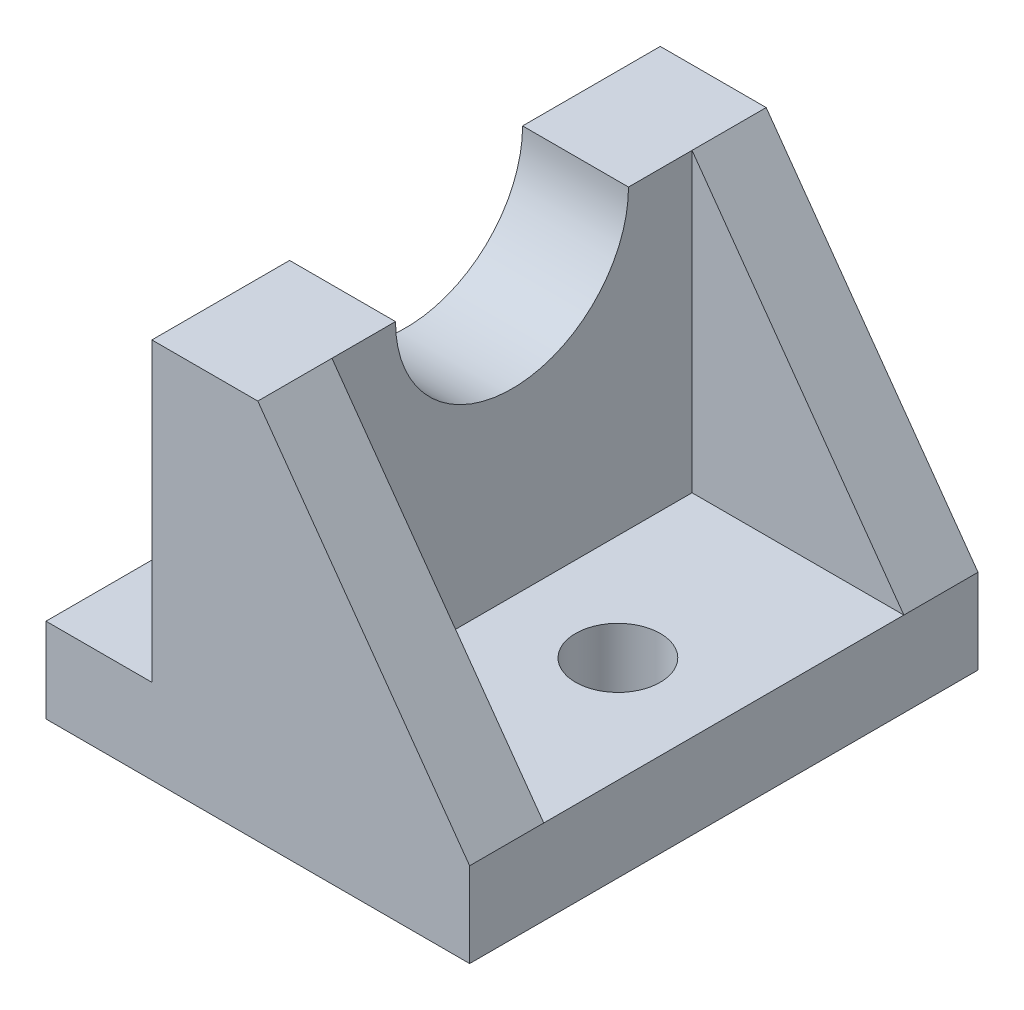
ISO-10303-21;
HEADER;
FILE_DESCRIPTION(('STEP AP214'),'2;1');
FILE_NAME('part.step','',(''),(''),'','','');
FILE_SCHEMA(('AUTOMOTIVE_DESIGN { 1 0 10303 214 1 1 1 1 }'));
ENDSEC;
DATA;
#1=APPLICATION_CONTEXT('core data for automotive mechanical design processes');
#2=APPLICATION_PROTOCOL_DEFINITION('international standard','automotive_design',2000,#1);
#3=PRODUCT_CONTEXT('',#1,'mechanical');
#4=PRODUCT('Part','Part','',(#3));
#5=PRODUCT_RELATED_PRODUCT_CATEGORY('part','',(#4));
#6=PRODUCT_DEFINITION_FORMATION('','',#4);
#7=PRODUCT_DEFINITION_CONTEXT('part definition',#1,'design');
#8=PRODUCT_DEFINITION('design','',#6,#7);
#9=PRODUCT_DEFINITION_SHAPE('','',#8);
#10=(LENGTH_UNIT() NAMED_UNIT(*) SI_UNIT(.MILLI.,.METRE.));
#11=(NAMED_UNIT(*) PLANE_ANGLE_UNIT() SI_UNIT($,.RADIAN.));
#12=(NAMED_UNIT(*) SI_UNIT($,.STERADIAN.) SOLID_ANGLE_UNIT());
#13=UNCERTAINTY_MEASURE_WITH_UNIT(LENGTH_MEASURE(1.E-05),#10,'distance_accuracy_value','');
#14=(GEOMETRIC_REPRESENTATION_CONTEXT(3) GLOBAL_UNCERTAINTY_ASSIGNED_CONTEXT((#13)) GLOBAL_UNIT_ASSIGNED_CONTEXT((#10,
#11,#12)) REPRESENTATION_CONTEXT('',''));
#15=CARTESIAN_POINT('',(0.,0.,0.));
#16=DIRECTION('',(0.,0.,1.));
#17=DIRECTION('',(1.,0.,0.));
#18=AXIS2_PLACEMENT_3D('',#15,#16,#17);
#19=CARTESIAN_POINT('',(0.,45.,60.));
#20=DIRECTION('',(0.,1.,0.));
#21=DIRECTION('',(0.,0.,1.));
#22=AXIS2_PLACEMENT_3D('',#19,#20,#21);
#23=PLANE('',#22);
#24=DIRECTION('',(-1.,0.,0.));
#25=VECTOR('',#24,1.);
#26=CARTESIAN_POINT('',(50.,45.,-27.5));
#27=LINE('',#26,#25);
#28=CARTESIAN_POINT('',(0.,45.,-27.5));
#29=VERTEX_POINT('',#28);
#30=CARTESIAN_POINT('',(-25.,45.,-27.5));
#31=VERTEX_POINT('',#30);
#32=EDGE_CURVE('E127',#29,#31,#27,.T.);
#33=ORIENTED_EDGE('',*,*,#32,.F.);
#34=DIRECTION('',(0.,0.,1.));
#35=VECTOR('',#34,1.);
#36=CARTESIAN_POINT('',(0.,45.,42.5));
#37=LINE('',#36,#35);
#38=CARTESIAN_POINT('',(0.,45.,-42.5));
#39=VERTEX_POINT('',#38);
#40=EDGE_CURVE('E247',#39,#29,#37,.T.);
#41=ORIENTED_EDGE('',*,*,#40,.F.);
#42=DIRECTION('',(0.,0.,-1.));
#43=VECTOR('',#42,1.);
#44=CARTESIAN_POINT('',(0.,45.,60.));
#45=LINE('',#44,#43);
#46=CARTESIAN_POINT('',(0.,45.,-60.));
#47=VERTEX_POINT('',#46);
#48=EDGE_CURVE('E234',#39,#47,#45,.T.);
#49=ORIENTED_EDGE('',*,*,#48,.T.);
#50=DIRECTION('',(1.,0.,0.));
#51=VECTOR('',#50,1.);
#52=CARTESIAN_POINT('',(0.,45.,-60.));
#53=LINE('',#52,#51);
#54=CARTESIAN_POINT('',(-25.,45.,-60.));
#55=VERTEX_POINT('',#54);
#56=EDGE_CURVE('E205',#55,#47,#53,.T.);
#57=ORIENTED_EDGE('',*,*,#56,.F.);
#58=DIRECTION('',(0.,0.,-1.));
#59=VECTOR('',#58,1.);
#60=CARTESIAN_POINT('',(-25.,45.,60.));
#61=LINE('',#60,#59);
#62=EDGE_CURVE('E145',#31,#55,#61,.T.);
#63=ORIENTED_EDGE('',*,*,#62,.F.);
#64=EDGE_LOOP('',(#33,#41,#49,#57,#63));
#65=FACE_BOUND('',#64,.T.);
#66=ADVANCED_FACE('F37',(#65),#23,.T.);
#67=CARTESIAN_POINT('',(21.2837837837838,15.2027027027027,60.));
#68=DIRECTION('',(0.813733471206735,0.581238193719096,0.));
#69=DIRECTION('',(-0.581238193719096,0.813733471206735,0.));
#70=AXIS2_PLACEMENT_3D('',#67,#68,#69);
#71=PLANE('',#70);
#72=DIRECTION('',(0.581238193719096,-0.813733471206735,0.));
#73=VECTOR('',#72,1.);
#74=CARTESIAN_POINT('',(21.2837837837838,15.2027027027027,42.5));
#75=LINE('',#74,#73);
#76=CARTESIAN_POINT('',(0.,45.,42.5));
#77=VERTEX_POINT('',#76);
#78=CARTESIAN_POINT('',(50.,-25.,42.5));
#79=VERTEX_POINT('',#78);
#80=EDGE_CURVE('E45',#77,#79,#75,.T.);
#81=ORIENTED_EDGE('',*,*,#80,.F.);
#82=CARTESIAN_POINT('',(0.,45.,60.));
#83=VERTEX_POINT('',#82);
#84=EDGE_CURVE('E182',#83,#77,#45,.T.);
#85=ORIENTED_EDGE('',*,*,#84,.F.);
#86=DIRECTION('',(0.581238193719096,-0.813733471206735,0.));
#87=VECTOR('',#86,1.);
#88=CARTESIAN_POINT('',(21.2837837837838,15.2027027027027,60.));
#89=LINE('',#88,#87);
#90=CARTESIAN_POINT('',(50.,-25.,60.));
#91=VERTEX_POINT('',#90);
#92=EDGE_CURVE('E176',#83,#91,#89,.T.);
#93=ORIENTED_EDGE('',*,*,#92,.T.);
#94=DIRECTION('',(0.,0.,-1.));
#95=VECTOR('',#94,1.);
#96=CARTESIAN_POINT('',(50.,-25.,60.));
#97=LINE('',#96,#95);
#98=EDGE_CURVE('E167',#91,#79,#97,.T.);
#99=ORIENTED_EDGE('',*,*,#98,.T.);
#100=EDGE_LOOP('',(#81,#85,#93,#99));
#101=FACE_BOUND('',#100,.T.);
#102=ADVANCED_FACE('F174',(#101),#71,.T.);
#103=DIRECTION('',(-1.,0.,0.));
#104=VECTOR('',#103,1.);
#105=CARTESIAN_POINT('',(50.,45.,27.5));
#106=LINE('',#105,#104);
#107=CARTESIAN_POINT('',(-25.,45.,27.5));
#108=VERTEX_POINT('',#107);
#109=CARTESIAN_POINT('',(0.,45.,27.5));
#110=VERTEX_POINT('',#109);
#111=EDGE_CURVE('E52',#108,#110,#106,.F.);
#112=ORIENTED_EDGE('',*,*,#111,.F.);
#113=CARTESIAN_POINT('',(-25.,45.,60.));
#114=VERTEX_POINT('',#113);
#115=EDGE_CURVE('E135',#114,#108,#61,.T.);
#116=ORIENTED_EDGE('',*,*,#115,.F.);
#117=DIRECTION('',(1.,0.,0.));
#118=VECTOR('',#117,1.);
#119=CARTESIAN_POINT('',(0.,45.,60.));
#120=LINE('',#119,#118);
#121=EDGE_CURVE('E219',#114,#83,#120,.T.);
#122=ORIENTED_EDGE('',*,*,#121,.T.);
#123=ORIENTED_EDGE('',*,*,#84,.T.);
#124=EDGE_CURVE('E138',#110,#77,#37,.T.);
#125=ORIENTED_EDGE('',*,*,#124,.F.);
#126=EDGE_LOOP('',(#112,#116,#122,#123,#125));
#127=FACE_BOUND('',#126,.T.);
#128=ADVANCED_FACE('F39',(#127),#23,.T.);
#129=CARTESIAN_POINT('',(-25.,0.,60.));
#130=DIRECTION('',(1.,0.,0.));
#131=DIRECTION('',(0.,1.,0.));
#132=AXIS2_PLACEMENT_3D('',#129,#130,#131);
#133=PLANE('',#132);
#134=ORIENTED_EDGE('',*,*,#115,.T.);
#135=CARTESIAN_POINT('',(-25.,45.,0.));
#136=DIRECTION('',(-1.,0.,0.));
#137=DIRECTION('',(0.,-1.,0.));
#138=AXIS2_PLACEMENT_3D('',#135,#136,#137);
#139=CIRCLE('',#138,27.5);
#140=EDGE_CURVE('E124',#31,#108,#139,.T.);
#141=ORIENTED_EDGE('',*,*,#140,.F.);
#142=ORIENTED_EDGE('',*,*,#62,.T.);
#143=DIRECTION('',(0.,-1.,0.));
#144=VECTOR('',#143,1.);
#145=CARTESIAN_POINT('',(-25.,0.,-60.));
#146=LINE('',#145,#144);
#147=CARTESIAN_POINT('',(-25.,-25.,-60.));
#148=VERTEX_POINT('',#147);
#149=EDGE_CURVE('E201',#55,#148,#146,.T.);
#150=ORIENTED_EDGE('',*,*,#149,.T.);
#151=DIRECTION('',(0.,0.,-1.));
#152=VECTOR('',#151,1.);
#153=CARTESIAN_POINT('',(-25.,-25.,60.));
#154=LINE('',#153,#152);
#155=CARTESIAN_POINT('',(-25.,-25.,60.));
#156=VERTEX_POINT('',#155);
#157=EDGE_CURVE('E148',#156,#148,#154,.T.);
#158=ORIENTED_EDGE('',*,*,#157,.F.);
#159=DIRECTION('',(0.,-1.,0.));
#160=VECTOR('',#159,1.);
#161=CARTESIAN_POINT('',(-25.,0.,60.));
#162=LINE('',#161,#160);
#163=EDGE_CURVE('E142',#114,#156,#162,.T.);
#164=ORIENTED_EDGE('',*,*,#163,.F.);
#165=EDGE_LOOP('',(#134,#141,#142,#150,#158,#164));
#166=FACE_BOUND('',#165,.T.);
#167=ADVANCED_FACE('F140',(#166),#133,.F.);
#168=CARTESIAN_POINT('',(0.,-25.,60.));
#169=DIRECTION('',(0.,1.,0.));
#170=DIRECTION('',(-1.,0.,0.));
#171=AXIS2_PLACEMENT_3D('',#168,#169,#170);
#172=PLANE('',#171);
#173=DIRECTION('',(1.,0.,0.));
#174=VECTOR('',#173,1.);
#175=CARTESIAN_POINT('',(0.,-25.,-60.));
#176=LINE('',#175,#174);
#177=CARTESIAN_POINT('',(-50.,-25.,-60.));
#178=VERTEX_POINT('',#177);
#179=EDGE_CURVE('E196',#178,#148,#176,.T.);
#180=ORIENTED_EDGE('',*,*,#179,.F.);
#181=DIRECTION('',(0.,0.,-1.));
#182=VECTOR('',#181,1.);
#183=CARTESIAN_POINT('',(-50.,-25.,60.));
#184=LINE('',#183,#182);
#185=CARTESIAN_POINT('',(-50.,-25.,60.));
#186=VERTEX_POINT('',#185);
#187=EDGE_CURVE('E186',#186,#178,#184,.T.);
#188=ORIENTED_EDGE('',*,*,#187,.F.);
#189=DIRECTION('',(1.,0.,0.));
#190=VECTOR('',#189,1.);
#191=CARTESIAN_POINT('',(0.,-25.,60.));
#192=LINE('',#191,#190);
#193=EDGE_CURVE('E199',#186,#156,#192,.T.);
#194=ORIENTED_EDGE('',*,*,#193,.T.);
#195=ORIENTED_EDGE('',*,*,#157,.T.);
#196=EDGE_LOOP('',(#180,#188,#194,#195));
#197=FACE_BOUND('',#196,.T.);
#198=ADVANCED_FACE('F194',(#197),#172,.T.);
#199=CARTESIAN_POINT('',(-50.,0.,60.));
#200=DIRECTION('',(-1.,0.,0.));
#201=DIRECTION('',(0.,0.,1.));
#202=AXIS2_PLACEMENT_3D('',#199,#200,#201);
#203=PLANE('',#202);
#204=DIRECTION('',(0.,1.,0.));
#205=VECTOR('',#204,1.);
#206=CARTESIAN_POINT('',(-50.,0.,-60.));
#207=LINE('',#206,#205);
#208=CARTESIAN_POINT('',(-50.,-45.,-60.));
#209=VERTEX_POINT('',#208);
#210=EDGE_CURVE('E209',#209,#178,#207,.T.);
#211=ORIENTED_EDGE('',*,*,#210,.F.);
#212=DIRECTION('',(0.,0.,-1.));
#213=VECTOR('',#212,1.);
#214=CARTESIAN_POINT('',(-50.,-45.,60.));
#215=LINE('',#214,#213);
#216=CARTESIAN_POINT('',(-50.,-45.,60.));
#217=VERTEX_POINT('',#216);
#218=EDGE_CURVE('E180',#217,#209,#215,.T.);
#219=ORIENTED_EDGE('',*,*,#218,.F.);
#220=DIRECTION('',(0.,1.,0.));
#221=VECTOR('',#220,1.);
#222=CARTESIAN_POINT('',(-50.,0.,60.));
#223=LINE('',#222,#221);
#224=EDGE_CURVE('E228',#217,#186,#223,.T.);
#225=ORIENTED_EDGE('',*,*,#224,.T.);
#226=ORIENTED_EDGE('',*,*,#187,.T.);
#227=EDGE_LOOP('',(#211,#219,#225,#226));
#228=FACE_BOUND('',#227,.T.);
#229=ADVANCED_FACE('F289',(#228),#203,.T.);
#230=CARTESIAN_POINT('',(0.,-45.,60.));
#231=DIRECTION('',(0.,1.,0.));
#232=DIRECTION('',(0.,0.,1.));
#233=AXIS2_PLACEMENT_3D('',#230,#231,#232);
#234=PLANE('',#233);
#235=CARTESIAN_POINT('',(25.,-45.,0.));
#236=DIRECTION('',(0.,1.,0.));
#237=DIRECTION('',(-1.,0.,0.));
#238=AXIS2_PLACEMENT_3D('',#235,#236,#237);
#239=CIRCLE('',#238,10.);
#240=CARTESIAN_POINT('',(15.,-45.,0.));
#241=VERTEX_POINT('',#240);
#242=EDGE_CURVE('E254',#241,#241,#239,.T.);
#243=ORIENTED_EDGE('',*,*,#242,.T.);
#244=EDGE_LOOP('',(#243));
#245=FACE_BOUND('',#244,.T.);
#246=DIRECTION('',(1.,0.,0.));
#247=VECTOR('',#246,1.);
#248=CARTESIAN_POINT('',(0.,-45.,-60.));
#249=LINE('',#248,#247);
#250=CARTESIAN_POINT('',(50.,-45.,-60.));
#251=VERTEX_POINT('',#250);
#252=EDGE_CURVE('E211',#209,#251,#249,.T.);
#253=ORIENTED_EDGE('',*,*,#252,.T.);
#254=DIRECTION('',(0.,0.,-1.));
#255=VECTOR('',#254,1.);
#256=CARTESIAN_POINT('',(50.,-45.,60.));
#257=LINE('',#256,#255);
#258=CARTESIAN_POINT('',(50.,-45.,60.));
#259=VERTEX_POINT('',#258);
#260=EDGE_CURVE('E177',#259,#251,#257,.T.);
#261=ORIENTED_EDGE('',*,*,#260,.F.);
#262=DIRECTION('',(1.,0.,0.));
#263=VECTOR('',#262,1.);
#264=CARTESIAN_POINT('',(0.,-45.,60.));
#265=LINE('',#264,#263);
#266=EDGE_CURVE('E230',#217,#259,#265,.T.);
#267=ORIENTED_EDGE('',*,*,#266,.F.);
#268=ORIENTED_EDGE('',*,*,#218,.T.);
#269=EDGE_LOOP('',(#253,#261,#267,#268));
#270=FACE_BOUND('',#269,.T.);
#271=ADVANCED_FACE('F259',(#245,#270),#234,.F.);
#272=CARTESIAN_POINT('',(50.,0.,60.));
#273=DIRECTION('',(-1.,0.,0.));
#274=DIRECTION('',(0.,0.,1.));
#275=AXIS2_PLACEMENT_3D('',#272,#273,#274);
#276=PLANE('',#275);
#277=DIRECTION('',(0.,1.,0.));
#278=VECTOR('',#277,1.);
#279=CARTESIAN_POINT('',(50.,0.,-60.));
#280=LINE('',#279,#278);
#281=CARTESIAN_POINT('',(50.,-25.,-60.));
#282=VERTEX_POINT('',#281);
#283=EDGE_CURVE('E216',#251,#282,#280,.T.);
#284=ORIENTED_EDGE('',*,*,#283,.T.);
#285=CARTESIAN_POINT('',(50.,-25.,-42.5));
#286=VERTEX_POINT('',#285);
#287=EDGE_CURVE('E169',#286,#282,#97,.T.);
#288=ORIENTED_EDGE('',*,*,#287,.F.);
#289=DIRECTION('',(0.,0.,1.));
#290=VECTOR('',#289,1.);
#291=CARTESIAN_POINT('',(50.,-25.,42.5));
#292=LINE('',#291,#290);
#293=EDGE_CURVE('E163',#286,#79,#292,.T.);
#294=ORIENTED_EDGE('',*,*,#293,.T.);
#295=ORIENTED_EDGE('',*,*,#98,.F.);
#296=DIRECTION('',(0.,1.,0.));
#297=VECTOR('',#296,1.);
#298=CARTESIAN_POINT('',(50.,0.,60.));
#299=LINE('',#298,#297);
#300=EDGE_CURVE('E232',#259,#91,#299,.T.);
#301=ORIENTED_EDGE('',*,*,#300,.F.);
#302=ORIENTED_EDGE('',*,*,#260,.T.);
#303=EDGE_LOOP('',(#284,#288,#294,#295,#301,#302));
#304=FACE_BOUND('',#303,.T.);
#305=ADVANCED_FACE('F165',(#304),#276,.F.);
#306=DIRECTION('',(-0.581238193719096,0.813733471206735,0.));
#307=VECTOR('',#306,1.);
#308=CARTESIAN_POINT('',(21.2837837837838,15.2027027027027,-42.5));
#309=LINE('',#308,#307);
#310=EDGE_CURVE('E144',#286,#39,#309,.T.);
#311=ORIENTED_EDGE('',*,*,#310,.F.);
#312=ORIENTED_EDGE('',*,*,#287,.T.);
#313=DIRECTION('',(0.581238193719096,-0.813733471206735,0.));
#314=VECTOR('',#313,1.);
#315=CARTESIAN_POINT('',(21.2837837837838,15.2027027027027,-60.));
#316=LINE('',#315,#314);
#317=EDGE_CURVE('E217',#47,#282,#316,.T.);
#318=ORIENTED_EDGE('',*,*,#317,.F.);
#319=ORIENTED_EDGE('',*,*,#48,.F.);
#320=EDGE_LOOP('',(#311,#312,#318,#319));
#321=FACE_BOUND('',#320,.T.);
#322=ADVANCED_FACE('F281',(#321),#71,.T.);
#323=CARTESIAN_POINT('',(0.,0.,60.));
#324=DIRECTION('',(0.,0.,1.));
#325=DIRECTION('',(1.,0.,0.));
#326=AXIS2_PLACEMENT_3D('',#323,#324,#325);
#327=PLANE('',#326);
#328=ORIENTED_EDGE('',*,*,#121,.F.);
#329=ORIENTED_EDGE('',*,*,#163,.T.);
#330=ORIENTED_EDGE('',*,*,#193,.F.);
#331=ORIENTED_EDGE('',*,*,#224,.F.);
#332=ORIENTED_EDGE('',*,*,#266,.T.);
#333=ORIENTED_EDGE('',*,*,#300,.T.);
#334=ORIENTED_EDGE('',*,*,#92,.F.);
#335=EDGE_LOOP('',(#328,#329,#330,#331,#332,#333,#334));
#336=FACE_BOUND('',#335,.T.);
#337=ADVANCED_FACE('F299',(#336),#327,.T.);
#338=CARTESIAN_POINT('',(0.,0.,-60.));
#339=DIRECTION('',(0.,0.,1.));
#340=DIRECTION('',(1.,0.,0.));
#341=AXIS2_PLACEMENT_3D('',#338,#339,#340);
#342=PLANE('',#341);
#343=ORIENTED_EDGE('',*,*,#56,.T.);
#344=ORIENTED_EDGE('',*,*,#317,.T.);
#345=ORIENTED_EDGE('',*,*,#283,.F.);
#346=ORIENTED_EDGE('',*,*,#252,.F.);
#347=ORIENTED_EDGE('',*,*,#210,.T.);
#348=ORIENTED_EDGE('',*,*,#179,.T.);
#349=ORIENTED_EDGE('',*,*,#149,.F.);
#350=EDGE_LOOP('',(#343,#344,#345,#346,#347,#348,#349));
#351=FACE_BOUND('',#350,.T.);
#352=ADVANCED_FACE('F207',(#351),#342,.F.);
#353=CARTESIAN_POINT('',(0.,-123.61541461658,42.5));
#354=DIRECTION('',(0.,0.,1.));
#355=DIRECTION('',(1.,0.,0.));
#356=AXIS2_PLACEMENT_3D('',#353,#354,#355);
#357=PLANE('',#356);
#358=ORIENTED_EDGE('',*,*,#80,.T.);
#359=DIRECTION('',(-1.,0.,0.));
#360=VECTOR('',#359,1.);
#361=CARTESIAN_POINT('',(0.,-25.,42.5));
#362=LINE('',#361,#360);
#363=CARTESIAN_POINT('',(0.,-25.,42.5));
#364=VERTEX_POINT('',#363);
#365=EDGE_CURVE('E59',#79,#364,#362,.T.);
#366=ORIENTED_EDGE('',*,*,#365,.T.);
#367=DIRECTION('',(0.,1.,0.));
#368=VECTOR('',#367,1.);
#369=CARTESIAN_POINT('',(0.,-123.61541461658,42.5));
#370=LINE('',#369,#368);
#371=EDGE_CURVE('E157',#364,#77,#370,.T.);
#372=ORIENTED_EDGE('',*,*,#371,.T.);
#373=EDGE_LOOP('',(#358,#366,#372));
#374=FACE_BOUND('',#373,.T.);
#375=ADVANCED_FACE('F155',(#374),#357,.F.);
#376=CARTESIAN_POINT('',(0.,-123.61541461658,42.5));
#377=DIRECTION('',(-1.,0.,0.));
#378=DIRECTION('',(0.,0.,1.));
#379=AXIS2_PLACEMENT_3D('',#376,#377,#378);
#380=PLANE('',#379);
#381=ORIENTED_EDGE('',*,*,#40,.T.);
#382=CARTESIAN_POINT('',(0.,45.,0.));
#383=DIRECTION('',(-1.,0.,0.));
#384=DIRECTION('',(0.,0.,1.));
#385=AXIS2_PLACEMENT_3D('',#382,#383,#384);
#386=CIRCLE('',#385,27.5);
#387=EDGE_CURVE('E11',#29,#110,#386,.T.);
#388=ORIENTED_EDGE('',*,*,#387,.T.);
#389=ORIENTED_EDGE('',*,*,#124,.T.);
#390=ORIENTED_EDGE('',*,*,#371,.F.);
#391=DIRECTION('',(0.,0.,-1.));
#392=VECTOR('',#391,1.);
#393=CARTESIAN_POINT('',(0.,-25.,42.5));
#394=LINE('',#393,#392);
#395=CARTESIAN_POINT('',(0.,-25.,-42.5));
#396=VERTEX_POINT('',#395);
#397=EDGE_CURVE('E241',#364,#396,#394,.T.);
#398=ORIENTED_EDGE('',*,*,#397,.T.);
#399=DIRECTION('',(0.,1.,0.));
#400=VECTOR('',#399,1.);
#401=CARTESIAN_POINT('',(0.,-123.61541461658,-42.5));
#402=LINE('',#401,#400);
#403=EDGE_CURVE('E239',#396,#39,#402,.T.);
#404=ORIENTED_EDGE('',*,*,#403,.T.);
#405=EDGE_LOOP('',(#381,#388,#389,#390,#398,#404));
#406=FACE_BOUND('',#405,.T.);
#407=ADVANCED_FACE('F245',(#406),#380,.F.);
#408=CARTESIAN_POINT('',(0.,-123.61541461658,-42.5));
#409=DIRECTION('',(0.,0.,-1.));
#410=DIRECTION('',(-1.,0.,0.));
#411=AXIS2_PLACEMENT_3D('',#408,#409,#410);
#412=PLANE('',#411);
#413=ORIENTED_EDGE('',*,*,#310,.T.);
#414=ORIENTED_EDGE('',*,*,#403,.F.);
#415=DIRECTION('',(1.,0.,0.));
#416=VECTOR('',#415,1.);
#417=CARTESIAN_POINT('',(0.,-25.,-42.5));
#418=LINE('',#417,#416);
#419=EDGE_CURVE('E172',#396,#286,#418,.T.);
#420=ORIENTED_EDGE('',*,*,#419,.T.);
#421=EDGE_LOOP('',(#413,#414,#420));
#422=FACE_BOUND('',#421,.T.);
#423=ADVANCED_FACE('F237',(#422),#412,.F.);
#424=CARTESIAN_POINT('',(0.,-25.,60.));
#425=DIRECTION('',(0.,1.,0.));
#426=DIRECTION('',(-1.,0.,0.));
#427=AXIS2_PLACEMENT_3D('',#424,#425,#426);
#428=PLANE('',#427);
#429=CARTESIAN_POINT('',(25.,-25.,0.));
#430=DIRECTION('',(0.,1.,0.));
#431=DIRECTION('',(-1.,0.,0.));
#432=AXIS2_PLACEMENT_3D('',#429,#430,#431);
#433=CIRCLE('',#432,10.);
#434=CARTESIAN_POINT('',(15.,-25.,0.));
#435=VERTEX_POINT('',#434);
#436=EDGE_CURVE('E251',#435,#435,#433,.T.);
#437=ORIENTED_EDGE('',*,*,#436,.F.);
#438=EDGE_LOOP('',(#437));
#439=FACE_BOUND('',#438,.T.);
#440=ORIENTED_EDGE('',*,*,#293,.F.);
#441=ORIENTED_EDGE('',*,*,#419,.F.);
#442=ORIENTED_EDGE('',*,*,#397,.F.);
#443=ORIENTED_EDGE('',*,*,#365,.F.);
#444=EDGE_LOOP('',(#440,#441,#442,#443));
#445=FACE_BOUND('',#444,.T.);
#446=ADVANCED_FACE('F240',(#439,#445),#428,.T.);
#447=CARTESIAN_POINT('',(25.,-45.,0.));
#448=DIRECTION('',(0.,1.,0.));
#449=DIRECTION('',(-1.,0.,0.));
#450=AXIS2_PLACEMENT_3D('',#447,#448,#449);
#451=CYLINDRICAL_SURFACE('',#450,10.);
#452=ORIENTED_EDGE('',*,*,#242,.F.);
#453=EDGE_LOOP('',(#452));
#454=FACE_BOUND('',#453,.T.);
#455=ORIENTED_EDGE('',*,*,#436,.T.);
#456=EDGE_LOOP('',(#455));
#457=FACE_BOUND('',#456,.T.);
#458=ADVANCED_FACE('F262',(#454,#457),#451,.F.);
#459=CARTESIAN_POINT('',(50.,45.,0.));
#460=DIRECTION('',(-1.,0.,0.));
#461=DIRECTION('',(0.,-1.,0.));
#462=AXIS2_PLACEMENT_3D('',#459,#460,#461);
#463=CYLINDRICAL_SURFACE('',#462,27.5);
#464=ORIENTED_EDGE('',*,*,#32,.T.);
#465=ORIENTED_EDGE('',*,*,#140,.T.);
#466=ORIENTED_EDGE('',*,*,#111,.T.);
#467=ORIENTED_EDGE('',*,*,#387,.F.);
#468=EDGE_LOOP('',(#464,#465,#466,#467));
#469=FACE_BOUND('',#468,.T.);
#470=ADVANCED_FACE('F125',(#469),#463,.F.);
#471=CLOSED_SHELL('',(#66,#102,#128,#167,#198,#229,#271,#305,#322,#337,#352,#375,#407,#423,#446,
#458,#470));
#472=MANIFOLD_SOLID_BREP('B2',#471);
#473=ADVANCED_BREP_SHAPE_REPRESENTATION('',(#18,#472),#14);
#474=SHAPE_DEFINITION_REPRESENTATION(#9,#473);
ENDSEC;
END-ISO-10303-21;
